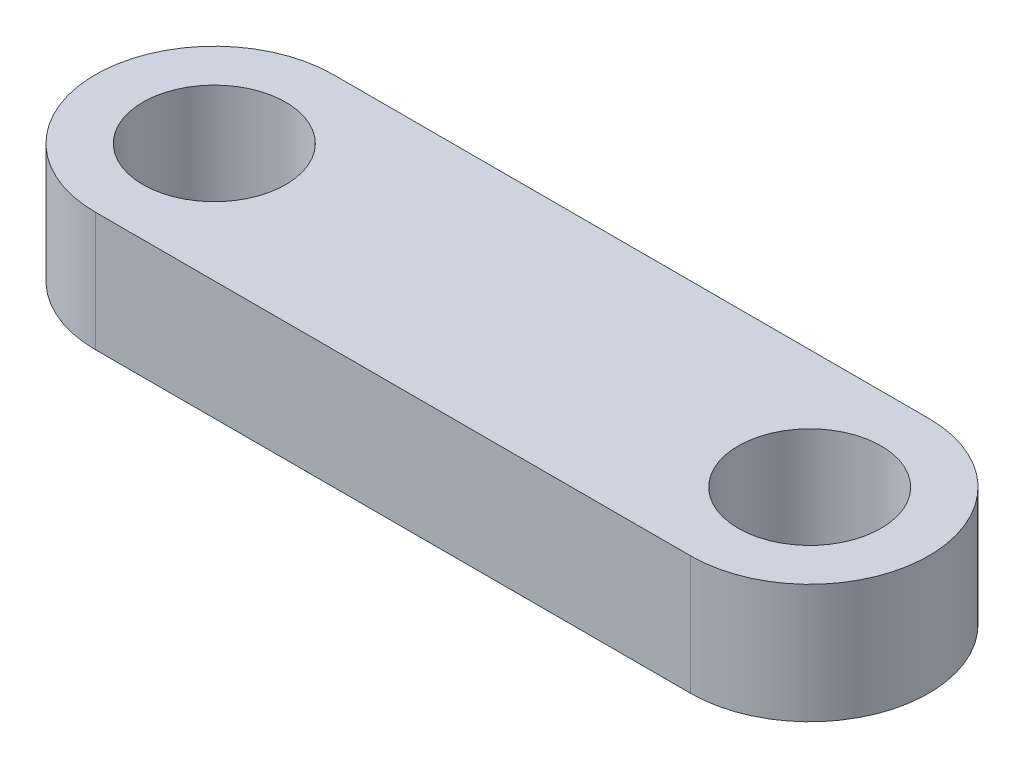
ISO-10303-21;
HEADER;
FILE_DESCRIPTION(('STEP AP214'),'2;1');
FILE_NAME('part.step','',(''),(''),'','','');
FILE_SCHEMA(('AUTOMOTIVE_DESIGN { 1 0 10303 214 1 1 1 1 }'));
ENDSEC;
DATA;
#1=APPLICATION_CONTEXT('core data for automotive mechanical design processes');
#2=APPLICATION_PROTOCOL_DEFINITION('international standard','automotive_design',2000,#1);
#3=PRODUCT_CONTEXT('',#1,'mechanical');
#4=PRODUCT('Part','Part','',(#3));
#5=PRODUCT_RELATED_PRODUCT_CATEGORY('part','',(#4));
#6=PRODUCT_DEFINITION_FORMATION('','',#4);
#7=PRODUCT_DEFINITION_CONTEXT('part definition',#1,'design');
#8=PRODUCT_DEFINITION('design','',#6,#7);
#9=PRODUCT_DEFINITION_SHAPE('','',#8);
#10=(LENGTH_UNIT() NAMED_UNIT(*) SI_UNIT(.MILLI.,.METRE.));
#11=(NAMED_UNIT(*) PLANE_ANGLE_UNIT() SI_UNIT($,.RADIAN.));
#12=(NAMED_UNIT(*) SI_UNIT($,.STERADIAN.) SOLID_ANGLE_UNIT());
#13=UNCERTAINTY_MEASURE_WITH_UNIT(LENGTH_MEASURE(1.E-05),#10,'distance_accuracy_value','');
#14=(GEOMETRIC_REPRESENTATION_CONTEXT(3) GLOBAL_UNCERTAINTY_ASSIGNED_CONTEXT((#13)) GLOBAL_UNIT_ASSIGNED_CONTEXT((#10,
#11,#12)) REPRESENTATION_CONTEXT('',''));
#15=CARTESIAN_POINT('',(0.,0.,0.));
#16=DIRECTION('',(0.,0.,1.));
#17=DIRECTION('',(1.,0.,0.));
#18=AXIS2_PLACEMENT_3D('',#15,#16,#17);
#19=CARTESIAN_POINT('',(-13.3522427797684,2.54,0.));
#20=DIRECTION('',(0.,1.,0.));
#21=DIRECTION('',(0.,0.,1.));
#22=AXIS2_PLACEMENT_3D('',#19,#20,#21);
#23=PLANE('',#22);
#24=CARTESIAN_POINT('',(-13.3522427797684,2.54,0.));
#25=DIRECTION('',(0.,1.,0.));
#26=DIRECTION('',(0.,0.,1.));
#27=AXIS2_PLACEMENT_3D('',#24,#25,#26);
#28=CIRCLE('',#27,1.524);
#29=CARTESIAN_POINT('',(-13.3522427797684,2.54,1.524));
#30=VERTEX_POINT('',#29);
#31=EDGE_CURVE('E119',#30,#30,#28,.T.);
#32=ORIENTED_EDGE('',*,*,#31,.F.);
#33=EDGE_LOOP('',(#32));
#34=FACE_BOUND('',#33,.T.);
#35=CARTESIAN_POINT('',(-13.3522427797684,2.54,0.));
#36=DIRECTION('',(0.,1.,0.));
#37=DIRECTION('',(0.,0.,1.));
#38=AXIS2_PLACEMENT_3D('',#35,#36,#37);
#39=CIRCLE('',#38,2.54);
#40=CARTESIAN_POINT('',(-13.3522427797684,2.54,-2.54));
#41=VERTEX_POINT('',#40);
#42=CARTESIAN_POINT('',(-13.3522427797684,2.54,2.54));
#43=VERTEX_POINT('',#42);
#44=EDGE_CURVE('E97',#41,#43,#39,.T.);
#45=ORIENTED_EDGE('',*,*,#44,.T.);
#46=DIRECTION('',(1.,0.,0.));
#47=VECTOR('',#46,1.);
#48=CARTESIAN_POINT('',(-13.3522427797684,2.54,2.54));
#49=LINE('',#48,#47);
#50=CARTESIAN_POINT('',(-0.652242779768431,2.54,2.54));
#51=VERTEX_POINT('',#50);
#52=EDGE_CURVE('E93',#43,#51,#49,.T.);
#53=ORIENTED_EDGE('',*,*,#52,.T.);
#54=CARTESIAN_POINT('',(-0.652242779768431,2.54,0.));
#55=DIRECTION('',(0.,1.,0.));
#56=DIRECTION('',(0.,0.,1.));
#57=AXIS2_PLACEMENT_3D('',#54,#55,#56);
#58=CIRCLE('',#57,2.54);
#59=CARTESIAN_POINT('',(-0.652242779768431,2.54,-2.54));
#60=VERTEX_POINT('',#59);
#61=EDGE_CURVE('E96',#51,#60,#58,.T.);
#62=ORIENTED_EDGE('',*,*,#61,.T.);
#63=DIRECTION('',(-1.,0.,0.));
#64=VECTOR('',#63,1.);
#65=CARTESIAN_POINT('',(-13.3522427797684,2.54,-2.54));
#66=LINE('',#65,#64);
#67=EDGE_CURVE('E64',#60,#41,#66,.T.);
#68=ORIENTED_EDGE('',*,*,#67,.T.);
#69=EDGE_LOOP('',(#45,#53,#62,#68));
#70=FACE_BOUND('',#69,.T.);
#71=CARTESIAN_POINT('',(-0.652242779768431,2.54,0.));
#72=DIRECTION('',(0.,1.,0.));
#73=DIRECTION('',(0.,0.,1.));
#74=AXIS2_PLACEMENT_3D('',#71,#72,#73);
#75=CIRCLE('',#74,1.524);
#76=CARTESIAN_POINT('',(-0.652242779768431,2.54,1.524));
#77=VERTEX_POINT('',#76);
#78=EDGE_CURVE('E139',#77,#77,#75,.T.);
#79=ORIENTED_EDGE('',*,*,#78,.F.);
#80=EDGE_LOOP('',(#79));
#81=FACE_BOUND('',#80,.T.);
#82=ADVANCED_FACE('F44',(#34,#70,#81),#23,.T.);
#83=CARTESIAN_POINT('',(-13.3522427797684,0.,0.));
#84=DIRECTION('',(0.,1.,0.));
#85=DIRECTION('',(0.,0.,1.));
#86=AXIS2_PLACEMENT_3D('',#83,#84,#85);
#87=PLANE('',#86);
#88=CARTESIAN_POINT('',(-13.3522427797684,0.,0.));
#89=DIRECTION('',(0.,1.,0.));
#90=DIRECTION('',(0.,0.,1.));
#91=AXIS2_PLACEMENT_3D('',#88,#89,#90);
#92=CIRCLE('',#91,2.54);
#93=CARTESIAN_POINT('',(-13.3522427797684,0.,-2.54));
#94=VERTEX_POINT('',#93);
#95=CARTESIAN_POINT('',(-13.3522427797684,0.,2.54));
#96=VERTEX_POINT('',#95);
#97=EDGE_CURVE('E114',#94,#96,#92,.T.);
#98=ORIENTED_EDGE('',*,*,#97,.F.);
#99=DIRECTION('',(-1.,0.,0.));
#100=VECTOR('',#99,1.);
#101=CARTESIAN_POINT('',(-13.3522427797684,0.,-2.54));
#102=LINE('',#101,#100);
#103=CARTESIAN_POINT('',(-0.652242779768431,0.,-2.54));
#104=VERTEX_POINT('',#103);
#105=EDGE_CURVE('E86',#104,#94,#102,.T.);
#106=ORIENTED_EDGE('',*,*,#105,.F.);
#107=CARTESIAN_POINT('',(-0.652242779768431,0.,0.));
#108=DIRECTION('',(0.,1.,0.));
#109=DIRECTION('',(0.,0.,1.));
#110=AXIS2_PLACEMENT_3D('',#107,#108,#109);
#111=CIRCLE('',#110,2.54);
#112=CARTESIAN_POINT('',(-0.652242779768431,0.,2.54));
#113=VERTEX_POINT('',#112);
#114=EDGE_CURVE('E79',#113,#104,#111,.T.);
#115=ORIENTED_EDGE('',*,*,#114,.F.);
#116=DIRECTION('',(1.,0.,0.));
#117=VECTOR('',#116,1.);
#118=CARTESIAN_POINT('',(-13.3522427797684,0.,2.54));
#119=LINE('',#118,#117);
#120=EDGE_CURVE('E104',#96,#113,#119,.T.);
#121=ORIENTED_EDGE('',*,*,#120,.F.);
#122=EDGE_LOOP('',(#98,#106,#115,#121));
#123=FACE_BOUND('',#122,.T.);
#124=CARTESIAN_POINT('',(-13.3522427797684,0.,0.));
#125=DIRECTION('',(0.,1.,0.));
#126=DIRECTION('',(0.,0.,1.));
#127=AXIS2_PLACEMENT_3D('',#124,#125,#126);
#128=CIRCLE('',#127,1.524);
#129=CARTESIAN_POINT('',(-13.3522427797684,0.,1.524));
#130=VERTEX_POINT('',#129);
#131=EDGE_CURVE('E136',#130,#130,#128,.T.);
#132=ORIENTED_EDGE('',*,*,#131,.T.);
#133=EDGE_LOOP('',(#132));
#134=FACE_BOUND('',#133,.T.);
#135=CARTESIAN_POINT('',(-0.652242779768431,0.,0.));
#136=DIRECTION('',(0.,1.,0.));
#137=DIRECTION('',(0.,0.,1.));
#138=AXIS2_PLACEMENT_3D('',#135,#136,#137);
#139=CIRCLE('',#138,1.524);
#140=CARTESIAN_POINT('',(-0.652242779768431,0.,1.524));
#141=VERTEX_POINT('',#140);
#142=EDGE_CURVE('E143',#141,#141,#139,.T.);
#143=ORIENTED_EDGE('',*,*,#142,.T.);
#144=EDGE_LOOP('',(#143));
#145=FACE_BOUND('',#144,.T.);
#146=ADVANCED_FACE('F131',(#123,#134,#145),#87,.F.);
#147=CARTESIAN_POINT('',(-13.3522427797684,2.54,0.));
#148=DIRECTION('',(0.,-1.,0.));
#149=DIRECTION('',(0.,0.,-1.));
#150=AXIS2_PLACEMENT_3D('',#147,#148,#149);
#151=CYLINDRICAL_SURFACE('',#150,2.54);
#152=ORIENTED_EDGE('',*,*,#97,.T.);
#153=DIRECTION('',(0.,-1.,0.));
#154=VECTOR('',#153,1.);
#155=CARTESIAN_POINT('',(-13.3522427797684,2.54,2.54));
#156=LINE('',#155,#154);
#157=EDGE_CURVE('E11',#43,#96,#156,.T.);
#158=ORIENTED_EDGE('',*,*,#157,.F.);
#159=ORIENTED_EDGE('',*,*,#44,.F.);
#160=DIRECTION('',(0.,-1.,0.));
#161=VECTOR('',#160,1.);
#162=CARTESIAN_POINT('',(-13.3522427797684,2.54,-2.54));
#163=LINE('',#162,#161);
#164=EDGE_CURVE('E110',#41,#94,#163,.T.);
#165=ORIENTED_EDGE('',*,*,#164,.T.);
#166=EDGE_LOOP('',(#152,#158,#159,#165));
#167=FACE_BOUND('',#166,.T.);
#168=ADVANCED_FACE('F50',(#167),#151,.T.);
#169=CARTESIAN_POINT('',(-13.3522427797684,2.54,2.54));
#170=DIRECTION('',(0.,0.,-1.));
#171=DIRECTION('',(-1.,0.,0.));
#172=AXIS2_PLACEMENT_3D('',#169,#170,#171);
#173=PLANE('',#172);
#174=ORIENTED_EDGE('',*,*,#120,.T.);
#175=DIRECTION('',(0.,-1.,0.));
#176=VECTOR('',#175,1.);
#177=CARTESIAN_POINT('',(-0.652242779768431,2.54,2.54));
#178=LINE('',#177,#176);
#179=EDGE_CURVE('E54',#51,#113,#178,.T.);
#180=ORIENTED_EDGE('',*,*,#179,.F.);
#181=ORIENTED_EDGE('',*,*,#52,.F.);
#182=ORIENTED_EDGE('',*,*,#157,.T.);
#183=EDGE_LOOP('',(#174,#180,#181,#182));
#184=FACE_BOUND('',#183,.T.);
#185=ADVANCED_FACE('F105',(#184),#173,.F.);
#186=CARTESIAN_POINT('',(-0.652242779768431,2.54,0.));
#187=DIRECTION('',(0.,-1.,0.));
#188=DIRECTION('',(0.,0.,-1.));
#189=AXIS2_PLACEMENT_3D('',#186,#187,#188);
#190=CYLINDRICAL_SURFACE('',#189,2.54);
#191=ORIENTED_EDGE('',*,*,#114,.T.);
#192=DIRECTION('',(0.,-1.,0.));
#193=VECTOR('',#192,1.);
#194=CARTESIAN_POINT('',(-0.652242779768431,2.54,-2.54));
#195=LINE('',#194,#193);
#196=EDGE_CURVE('E103',#60,#104,#195,.T.);
#197=ORIENTED_EDGE('',*,*,#196,.F.);
#198=ORIENTED_EDGE('',*,*,#61,.F.);
#199=ORIENTED_EDGE('',*,*,#179,.T.);
#200=EDGE_LOOP('',(#191,#197,#198,#199));
#201=FACE_BOUND('',#200,.T.);
#202=ADVANCED_FACE('F106',(#201),#190,.T.);
#203=CARTESIAN_POINT('',(-13.3522427797684,2.54,-2.54));
#204=DIRECTION('',(0.,0.,1.));
#205=DIRECTION('',(1.,0.,0.));
#206=AXIS2_PLACEMENT_3D('',#203,#204,#205);
#207=PLANE('',#206);
#208=ORIENTED_EDGE('',*,*,#105,.T.);
#209=ORIENTED_EDGE('',*,*,#164,.F.);
#210=ORIENTED_EDGE('',*,*,#67,.F.);
#211=ORIENTED_EDGE('',*,*,#196,.T.);
#212=EDGE_LOOP('',(#208,#209,#210,#211));
#213=FACE_BOUND('',#212,.T.);
#214=ADVANCED_FACE('F126',(#213),#207,.F.);
#215=CARTESIAN_POINT('',(-13.3522427797684,2.54,0.));
#216=DIRECTION('',(0.,-1.,0.));
#217=DIRECTION('',(0.,0.,-1.));
#218=AXIS2_PLACEMENT_3D('',#215,#216,#217);
#219=CYLINDRICAL_SURFACE('',#218,1.524);
#220=ORIENTED_EDGE('',*,*,#31,.T.);
#221=EDGE_LOOP('',(#220));
#222=FACE_BOUND('',#221,.T.);
#223=ORIENTED_EDGE('',*,*,#131,.F.);
#224=EDGE_LOOP('',(#223));
#225=FACE_BOUND('',#224,.T.);
#226=ADVANCED_FACE('F164',(#222,#225),#219,.F.);
#227=CARTESIAN_POINT('',(-0.652242779768431,2.54,0.));
#228=DIRECTION('',(0.,-1.,0.));
#229=DIRECTION('',(0.,0.,-1.));
#230=AXIS2_PLACEMENT_3D('',#227,#228,#229);
#231=CYLINDRICAL_SURFACE('',#230,1.524);
#232=ORIENTED_EDGE('',*,*,#78,.T.);
#233=EDGE_LOOP('',(#232));
#234=FACE_BOUND('',#233,.T.);
#235=ORIENTED_EDGE('',*,*,#142,.F.);
#236=EDGE_LOOP('',(#235));
#237=FACE_BOUND('',#236,.T.);
#238=ADVANCED_FACE('F152',(#234,#237),#231,.F.);
#239=CLOSED_SHELL('',(#82,#146,#168,#185,#202,#214,#226,#238));
#240=MANIFOLD_SOLID_BREP('B2',#239);
#241=ADVANCED_BREP_SHAPE_REPRESENTATION('',(#18,#240),#14);
#242=SHAPE_DEFINITION_REPRESENTATION(#9,#241);
ENDSEC;
END-ISO-10303-21;
